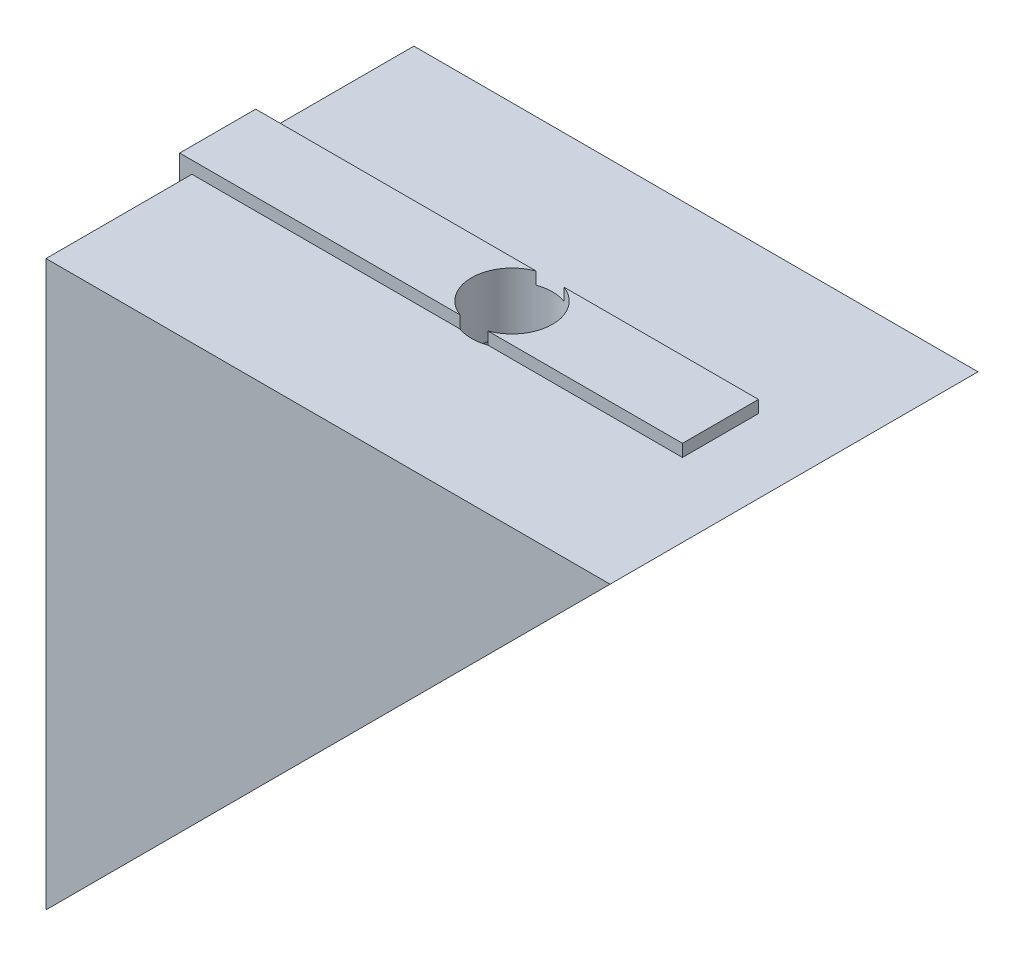
ISO-10303-21;
HEADER;
FILE_DESCRIPTION(('STEP AP214'),'2;1');
FILE_NAME('part.step','',(''),(''),'','','');
FILE_SCHEMA(('AUTOMOTIVE_DESIGN { 1 0 10303 214 1 1 1 1 }'));
ENDSEC;
DATA;
#1=APPLICATION_CONTEXT('core data for automotive mechanical design processes');
#2=APPLICATION_PROTOCOL_DEFINITION('international standard','automotive_design',2000,#1);
#3=PRODUCT_CONTEXT('',#1,'mechanical');
#4=PRODUCT('Part','Part','',(#3));
#5=PRODUCT_RELATED_PRODUCT_CATEGORY('part','',(#4));
#6=PRODUCT_DEFINITION_FORMATION('','',#4);
#7=PRODUCT_DEFINITION_CONTEXT('part definition',#1,'design');
#8=PRODUCT_DEFINITION('design','',#6,#7);
#9=PRODUCT_DEFINITION_SHAPE('','',#8);
#10=(LENGTH_UNIT() NAMED_UNIT(*) SI_UNIT(.MILLI.,.METRE.));
#11=(NAMED_UNIT(*) PLANE_ANGLE_UNIT() SI_UNIT($,.RADIAN.));
#12=(NAMED_UNIT(*) SI_UNIT($,.STERADIAN.) SOLID_ANGLE_UNIT());
#13=UNCERTAINTY_MEASURE_WITH_UNIT(LENGTH_MEASURE(1.E-05),#10,'distance_accuracy_value','');
#14=(GEOMETRIC_REPRESENTATION_CONTEXT(3) GLOBAL_UNCERTAINTY_ASSIGNED_CONTEXT((#13)) GLOBAL_UNIT_ASSIGNED_CONTEXT((#10,
#11,#12)) REPRESENTATION_CONTEXT('',''));
#15=CARTESIAN_POINT('',(0.,0.,0.));
#16=DIRECTION('',(0.,0.,1.));
#17=DIRECTION('',(1.,0.,0.));
#18=AXIS2_PLACEMENT_3D('',#15,#16,#17);
#19=CARTESIAN_POINT('',(-195.002,-19.,7.5));
#20=DIRECTION('',(1.,0.,0.));
#21=DIRECTION('',(0.,0.,-1.));
#22=AXIS2_PLACEMENT_3D('',#19,#20,#21);
#23=CYLINDRICAL_SURFACE('',#22,1.65);
#24=CARTESIAN_POINT('',(-180.,-19.,7.5));
#25=DIRECTION('',(1.,0.,0.));
#26=DIRECTION('',(0.,0.,1.));
#27=AXIS2_PLACEMENT_3D('',#24,#25,#26);
#28=CIRCLE('',#27,1.65);
#29=CARTESIAN_POINT('',(-180.,-18.4343145750507,5.95));
#30=VERTEX_POINT('',#29);
#31=CARTESIAN_POINT('',(-180.,-19.5656854249492,5.95));
#32=VERTEX_POINT('',#31);
#33=EDGE_CURVE('E300',#30,#32,#28,.F.);
#34=ORIENTED_EDGE('',*,*,#33,.T.);
#35=DIRECTION('',(1.,0.,0.));
#36=VECTOR('',#35,1.);
#37=CARTESIAN_POINT('',(-180.5,-19.5656854249492,5.95));
#38=LINE('',#37,#36);
#39=CARTESIAN_POINT('',(-180.5,-19.5656854249492,5.95));
#40=VERTEX_POINT('',#39);
#41=EDGE_CURVE('E396',#40,#32,#38,.T.);
#42=ORIENTED_EDGE('',*,*,#41,.F.);
#43=CARTESIAN_POINT('',(-180.5,-19.,7.5));
#44=DIRECTION('',(1.,0.,0.));
#45=DIRECTION('',(0.,0.,1.));
#46=AXIS2_PLACEMENT_3D('',#43,#44,#45);
#47=CIRCLE('',#46,1.65);
#48=CARTESIAN_POINT('',(-180.5,-19.5656854249492,9.05));
#49=VERTEX_POINT('',#48);
#50=EDGE_CURVE('E430',#40,#49,#47,.F.);
#51=ORIENTED_EDGE('',*,*,#50,.T.);
#52=DIRECTION('',(1.,0.,0.));
#53=VECTOR('',#52,1.);
#54=CARTESIAN_POINT('',(-180.5,-19.5656854249492,9.05));
#55=LINE('',#54,#53);
#56=CARTESIAN_POINT('',(-180.,-19.5656854249492,9.05));
#57=VERTEX_POINT('',#56);
#58=EDGE_CURVE('E416',#49,#57,#55,.T.);
#59=ORIENTED_EDGE('',*,*,#58,.T.);
#60=CARTESIAN_POINT('',(-180.,-18.4343145750507,9.05));
#61=VERTEX_POINT('',#60);
#62=EDGE_CURVE('E311',#57,#61,#28,.F.);
#63=ORIENTED_EDGE('',*,*,#62,.T.);
#64=DIRECTION('',(1.,0.,0.));
#65=VECTOR('',#64,1.);
#66=CARTESIAN_POINT('',(-180.5,-18.4343145750507,9.05));
#67=LINE('',#66,#65);
#68=CARTESIAN_POINT('',(-180.5,-18.4343145750507,9.05));
#69=VERTEX_POINT('',#68);
#70=EDGE_CURVE('E371',#69,#61,#67,.T.);
#71=ORIENTED_EDGE('',*,*,#70,.F.);
#72=CARTESIAN_POINT('',(-180.5,-19.,7.5));
#73=DIRECTION('',(1.,0.,0.));
#74=DIRECTION('',(0.,0.,1.));
#75=AXIS2_PLACEMENT_3D('',#72,#73,#74);
#76=CIRCLE('',#75,1.65);
#77=CARTESIAN_POINT('',(-180.5,-18.4343145750507,5.95));
#78=VERTEX_POINT('',#77);
#79=EDGE_CURVE('E390',#69,#78,#76,.F.);
#80=ORIENTED_EDGE('',*,*,#79,.T.);
#81=DIRECTION('',(1.,0.,0.));
#82=VECTOR('',#81,1.);
#83=CARTESIAN_POINT('',(-180.5,-18.4343145750507,5.95));
#84=LINE('',#83,#82);
#85=EDGE_CURVE('E387',#78,#30,#84,.T.);
#86=ORIENTED_EDGE('',*,*,#85,.T.);
#87=EDGE_LOOP('',(#34,#42,#51,#59,#63,#71,#80,#86));
#88=FACE_BOUND('',#87,.T.);
#89=CARTESIAN_POINT('',(-178.,-19.,7.5));
#90=DIRECTION('',(-1.,0.,0.));
#91=DIRECTION('',(0.,-1.,0.));
#92=AXIS2_PLACEMENT_3D('',#89,#90,#91);
#93=CIRCLE('',#92,1.65);
#94=CARTESIAN_POINT('',(-178.,-20.65,7.5));
#95=VERTEX_POINT('',#94);
#96=EDGE_CURVE('E316',#95,#95,#93,.T.);
#97=ORIENTED_EDGE('',*,*,#96,.F.);
#98=EDGE_LOOP('',(#97));
#99=FACE_BOUND('',#98,.T.);
#100=ADVANCED_FACE('F16',(#88,#99),#23,.F.);
#101=CARTESIAN_POINT('',(-168.5,-7.49799999999992,7.5));
#102=DIRECTION('',(0.,-1.,0.));
#103=DIRECTION('',(0.,0.,1.));
#104=AXIS2_PLACEMENT_3D('',#101,#102,#103);
#105=CYLINDRICAL_SURFACE('',#104,1.65);
#106=CARTESIAN_POINT('',(-168.5,-7.49999999999992,7.5));
#107=DIRECTION('',(0.,1.,0.));
#108=DIRECTION('',(0.,0.,1.));
#109=AXIS2_PLACEMENT_3D('',#106,#107,#108);
#110=CIRCLE('',#109,1.65);
#111=CARTESIAN_POINT('',(-169.065685424949,-7.49999999999992,5.95));
#112=VERTEX_POINT('',#111);
#113=CARTESIAN_POINT('',(-167.93431457505,-7.49999999999992,5.95));
#114=VERTEX_POINT('',#113);
#115=EDGE_CURVE('E212',#112,#114,#110,.F.);
#116=ORIENTED_EDGE('',*,*,#115,.F.);
#117=DIRECTION('',(0.,-1.,0.));
#118=VECTOR('',#117,1.);
#119=CARTESIAN_POINT('',(-169.065685424949,-6.99999999999992,5.95));
#120=LINE('',#119,#118);
#121=CARTESIAN_POINT('',(-169.065685424949,-6.99999999999992,5.95));
#122=VERTEX_POINT('',#121);
#123=EDGE_CURVE('E317',#122,#112,#120,.T.);
#124=ORIENTED_EDGE('',*,*,#123,.F.);
#125=CARTESIAN_POINT('',(-168.5,-6.99999999999992,7.5));
#126=DIRECTION('',(0.,1.,0.));
#127=DIRECTION('',(0.,0.,1.));
#128=AXIS2_PLACEMENT_3D('',#125,#126,#127);
#129=CIRCLE('',#128,1.65);
#130=CARTESIAN_POINT('',(-169.065685424949,-6.99999999999992,9.05));
#131=VERTEX_POINT('',#130);
#132=EDGE_CURVE('E341',#131,#122,#129,.F.);
#133=ORIENTED_EDGE('',*,*,#132,.F.);
#134=DIRECTION('',(0.,-1.,0.));
#135=VECTOR('',#134,1.);
#136=CARTESIAN_POINT('',(-169.065685424949,-6.99999999999992,9.05));
#137=LINE('',#136,#135);
#138=CARTESIAN_POINT('',(-169.065685424949,-7.49999999999992,9.05));
#139=VERTEX_POINT('',#138);
#140=EDGE_CURVE('E325',#131,#139,#137,.T.);
#141=ORIENTED_EDGE('',*,*,#140,.T.);
#142=CARTESIAN_POINT('',(-167.93431457505,-7.49999999999992,9.05));
#143=VERTEX_POINT('',#142);
#144=EDGE_CURVE('E294',#143,#139,#110,.F.);
#145=ORIENTED_EDGE('',*,*,#144,.F.);
#146=DIRECTION('',(0.,-1.,0.));
#147=VECTOR('',#146,1.);
#148=CARTESIAN_POINT('',(-167.93431457505,-6.99999999999992,9.05));
#149=LINE('',#148,#147);
#150=CARTESIAN_POINT('',(-167.93431457505,-6.99999999999992,9.05));
#151=VERTEX_POINT('',#150);
#152=EDGE_CURVE('E358',#151,#143,#149,.T.);
#153=ORIENTED_EDGE('',*,*,#152,.F.);
#154=CARTESIAN_POINT('',(-168.5,-6.99999999999992,7.5));
#155=DIRECTION('',(0.,1.,0.));
#156=DIRECTION('',(0.,0.,1.));
#157=AXIS2_PLACEMENT_3D('',#154,#155,#156);
#158=CIRCLE('',#157,1.65);
#159=CARTESIAN_POINT('',(-167.93431457505,-6.99999999999992,5.95));
#160=VERTEX_POINT('',#159);
#161=EDGE_CURVE('E367',#160,#151,#158,.F.);
#162=ORIENTED_EDGE('',*,*,#161,.F.);
#163=DIRECTION('',(0.,-1.,0.));
#164=VECTOR('',#163,1.);
#165=CARTESIAN_POINT('',(-167.93431457505,-6.99999999999992,5.95));
#166=LINE('',#165,#164);
#167=EDGE_CURVE('E340',#160,#114,#166,.T.);
#168=ORIENTED_EDGE('',*,*,#167,.T.);
#169=EDGE_LOOP('',(#116,#124,#133,#141,#145,#153,#162,#168));
#170=FACE_BOUND('',#169,.T.);
#171=CARTESIAN_POINT('',(-168.5,-9.5,7.5));
#172=DIRECTION('',(0.,1.,0.));
#173=DIRECTION('',(-1.,0.,0.));
#174=AXIS2_PLACEMENT_3D('',#171,#172,#173);
#175=CIRCLE('',#174,1.65);
#176=CARTESIAN_POINT('',(-170.15,-9.5,7.5));
#177=VERTEX_POINT('',#176);
#178=EDGE_CURVE('E299',#177,#177,#175,.T.);
#179=ORIENTED_EDGE('',*,*,#178,.F.);
#180=EDGE_LOOP('',(#179));
#181=FACE_BOUND('',#180,.T.);
#182=ADVANCED_FACE('F464',(#170,#181),#105,.F.);
#183=CARTESIAN_POINT('',(-168.5,-10.5,15.));
#184=DIRECTION('',(0.,-1.,0.));
#185=DIRECTION('',(0.,0.,1.));
#186=AXIS2_PLACEMENT_3D('',#183,#184,#185);
#187=PLANE('',#186);
#188=CARTESIAN_POINT('',(-168.5,-10.5,7.5));
#189=DIRECTION('',(0.,1.,0.));
#190=DIRECTION('',(-1.,0.,0.));
#191=AXIS2_PLACEMENT_3D('',#188,#189,#190);
#192=CIRCLE('',#191,2.8);
#193=CARTESIAN_POINT('',(-171.3,-10.5,7.5));
#194=VERTEX_POINT('',#193);
#195=EDGE_CURVE('E295',#194,#194,#192,.T.);
#196=ORIENTED_EDGE('',*,*,#195,.T.);
#197=EDGE_LOOP('',(#196));
#198=FACE_BOUND('',#197,.T.);
#199=DIRECTION('',(0.,0.,-1.));
#200=VECTOR('',#199,1.);
#201=CARTESIAN_POINT('',(-177.,-10.5,15.));
#202=LINE('',#201,#200);
#203=CARTESIAN_POINT('',(-177.,-10.5,13.));
#204=VERTEX_POINT('',#203);
#205=CARTESIAN_POINT('',(-177.,-10.5,2.));
#206=VERTEX_POINT('',#205);
#207=EDGE_CURVE('E235',#204,#206,#202,.T.);
#208=ORIENTED_EDGE('',*,*,#207,.T.);
#209=DIRECTION('',(1.,0.,0.));
#210=VECTOR('',#209,1.);
#211=CARTESIAN_POINT('',(-168.5,-10.5,2.));
#212=LINE('',#211,#210);
#213=CARTESIAN_POINT('',(-160.,-10.5,2.));
#214=VERTEX_POINT('',#213);
#215=EDGE_CURVE('E263',#206,#214,#212,.T.);
#216=ORIENTED_EDGE('',*,*,#215,.T.);
#217=DIRECTION('',(0.,0.,-1.));
#218=VECTOR('',#217,1.);
#219=CARTESIAN_POINT('',(-160.,-10.5,15.));
#220=LINE('',#219,#218);
#221=CARTESIAN_POINT('',(-160.,-10.5,13.));
#222=VERTEX_POINT('',#221);
#223=EDGE_CURVE('E247',#222,#214,#220,.T.);
#224=ORIENTED_EDGE('',*,*,#223,.F.);
#225=DIRECTION('',(1.,0.,0.));
#226=VECTOR('',#225,1.);
#227=CARTESIAN_POINT('',(-168.5,-10.5,13.));
#228=LINE('',#227,#226);
#229=EDGE_CURVE('E265',#204,#222,#228,.T.);
#230=ORIENTED_EDGE('',*,*,#229,.F.);
#231=EDGE_LOOP('',(#208,#216,#224,#230));
#232=FACE_BOUND('',#231,.T.);
#233=ADVANCED_FACE('F260',(#198,#232),#187,.T.);
#234=CARTESIAN_POINT('',(-177.,-19.,15.));
#235=DIRECTION('',(1.,0.,0.));
#236=DIRECTION('',(0.,0.,-1.));
#237=AXIS2_PLACEMENT_3D('',#234,#235,#236);
#238=PLANE('',#237);
#239=CARTESIAN_POINT('',(-177.,-19.,7.5));
#240=DIRECTION('',(-1.,0.,0.));
#241=DIRECTION('',(0.,-1.,0.));
#242=AXIS2_PLACEMENT_3D('',#239,#240,#241);
#243=CIRCLE('',#242,2.8);
#244=CARTESIAN_POINT('',(-177.,-21.8,7.5));
#245=VERTEX_POINT('',#244);
#246=EDGE_CURVE('E312',#245,#245,#243,.T.);
#247=ORIENTED_EDGE('',*,*,#246,.T.);
#248=EDGE_LOOP('',(#247));
#249=FACE_BOUND('',#248,.T.);
#250=DIRECTION('',(0.,0.,-1.));
#251=VECTOR('',#250,1.);
#252=CARTESIAN_POINT('',(-177.,-27.5,15.));
#253=LINE('',#252,#251);
#254=CARTESIAN_POINT('',(-177.,-27.5,13.));
#255=VERTEX_POINT('',#254);
#256=CARTESIAN_POINT('',(-177.,-27.5,2.));
#257=VERTEX_POINT('',#256);
#258=EDGE_CURVE('E228',#255,#257,#253,.T.);
#259=ORIENTED_EDGE('',*,*,#258,.T.);
#260=DIRECTION('',(0.,1.,0.));
#261=VECTOR('',#260,1.);
#262=CARTESIAN_POINT('',(-177.,-19.,2.));
#263=LINE('',#262,#261);
#264=EDGE_CURVE('E272',#257,#206,#263,.T.);
#265=ORIENTED_EDGE('',*,*,#264,.T.);
#266=ORIENTED_EDGE('',*,*,#207,.F.);
#267=DIRECTION('',(0.,1.,0.));
#268=VECTOR('',#267,1.);
#269=CARTESIAN_POINT('',(-177.,-19.,13.));
#270=LINE('',#269,#268);
#271=EDGE_CURVE('E269',#255,#204,#270,.T.);
#272=ORIENTED_EDGE('',*,*,#271,.F.);
#273=EDGE_LOOP('',(#259,#265,#266,#272));
#274=FACE_BOUND('',#273,.T.);
#275=ADVANCED_FACE('F268',(#249,#274),#238,.T.);
#276=CARTESIAN_POINT('',(-178.5,-27.5,15.));
#277=DIRECTION('',(0.,-1.,0.));
#278=DIRECTION('',(0.,0.,1.));
#279=AXIS2_PLACEMENT_3D('',#276,#277,#278);
#280=PLANE('',#279);
#281=DIRECTION('',(0.,0.,1.));
#282=VECTOR('',#281,1.);
#283=CARTESIAN_POINT('',(-180.,-27.5,-0.00200000000000027));
#284=LINE('',#283,#282);
#285=CARTESIAN_POINT('',(-180.,-27.5,5.95));
#286=VERTEX_POINT('',#285);
#287=CARTESIAN_POINT('',(-180.,-27.5,9.05));
#288=VERTEX_POINT('',#287);
#289=EDGE_CURVE('E440',#286,#288,#284,.T.);
#290=ORIENTED_EDGE('',*,*,#289,.T.);
#291=DIRECTION('',(1.,0.,0.));
#292=VECTOR('',#291,1.);
#293=CARTESIAN_POINT('',(-180.5,-27.5,9.05));
#294=LINE('',#293,#292);
#295=CARTESIAN_POINT('',(-180.5,-27.5,9.05));
#296=VERTEX_POINT('',#295);
#297=EDGE_CURVE('E412',#296,#288,#294,.T.);
#298=ORIENTED_EDGE('',*,*,#297,.F.);
#299=DIRECTION('',(0.,0.,-1.));
#300=VECTOR('',#299,1.);
#301=CARTESIAN_POINT('',(-180.5,-27.5,15.));
#302=LINE('',#301,#300);
#303=CARTESIAN_POINT('',(-180.5,-27.5,5.95));
#304=VERTEX_POINT('',#303);
#305=EDGE_CURVE('E424',#296,#304,#302,.T.);
#306=ORIENTED_EDGE('',*,*,#305,.T.);
#307=DIRECTION('',(1.,0.,0.));
#308=VECTOR('',#307,1.);
#309=CARTESIAN_POINT('',(-180.5,-27.5,5.95));
#310=LINE('',#309,#308);
#311=EDGE_CURVE('E408',#304,#286,#310,.T.);
#312=ORIENTED_EDGE('',*,*,#311,.T.);
#313=EDGE_LOOP('',(#290,#298,#306,#312));
#314=FACE_BOUND('',#313,.T.);
#315=ADVANCED_FACE('F18',(#314),#280,.T.);
#316=CARTESIAN_POINT('',(-180.,-17.5,15.));
#317=DIRECTION('',(1.,0.,0.));
#318=DIRECTION('',(0.,0.,-1.));
#319=AXIS2_PLACEMENT_3D('',#316,#317,#318);
#320=PLANE('',#319);
#321=ORIENTED_EDGE('',*,*,#33,.F.);
#322=DIRECTION('',(0.,-1.,0.));
#323=VECTOR('',#322,1.);
#324=CARTESIAN_POINT('',(-180.,-16.9,5.95));
#325=LINE('',#324,#323);
#326=CARTESIAN_POINT('',(-180.,-7.49999999999992,5.95));
#327=VERTEX_POINT('',#326);
#328=EDGE_CURVE('E392',#327,#30,#325,.T.);
#329=ORIENTED_EDGE('',*,*,#328,.F.);
#330=DIRECTION('',(0.,0.,-1.));
#331=VECTOR('',#330,1.);
#332=CARTESIAN_POINT('',(-180.,-7.49999999999992,15.));
#333=LINE('',#332,#331);
#334=CARTESIAN_POINT('',(-180.,-7.49999999999992,0.));
#335=VERTEX_POINT('',#334);
#336=EDGE_CURVE('E250',#327,#335,#333,.T.);
#337=ORIENTED_EDGE('',*,*,#336,.T.);
#338=DIRECTION('',(0.,1.,0.));
#339=VECTOR('',#338,1.);
#340=CARTESIAN_POINT('',(-180.,-17.5,0.));
#341=LINE('',#340,#339);
#342=CARTESIAN_POINT('',(-180.,-30.5,0.));
#343=VERTEX_POINT('',#342);
#344=EDGE_CURVE('E242',#343,#335,#341,.T.);
#345=ORIENTED_EDGE('',*,*,#344,.F.);
#346=DIRECTION('',(0.,0.,1.));
#347=VECTOR('',#346,1.);
#348=CARTESIAN_POINT('',(-180.,-30.5,-0.00200000000000027));
#349=LINE('',#348,#347);
#350=CARTESIAN_POINT('',(-180.,-30.5,15.));
#351=VERTEX_POINT('',#350);
#352=EDGE_CURVE('E427',#343,#351,#349,.T.);
#353=ORIENTED_EDGE('',*,*,#352,.T.);
#354=DIRECTION('',(0.,1.,0.));
#355=VECTOR('',#354,1.);
#356=CARTESIAN_POINT('',(-180.,-17.5,15.));
#357=LINE('',#356,#355);
#358=CARTESIAN_POINT('',(-180.,-7.49999999999992,15.));
#359=VERTEX_POINT('',#358);
#360=EDGE_CURVE('E206',#351,#359,#357,.T.);
#361=ORIENTED_EDGE('',*,*,#360,.T.);
#362=CARTESIAN_POINT('',(-180.,-7.49999999999992,9.05));
#363=VERTEX_POINT('',#362);
#364=EDGE_CURVE('E20',#359,#363,#333,.T.);
#365=ORIENTED_EDGE('',*,*,#364,.T.);
#366=DIRECTION('',(0.,-1.,0.));
#367=VECTOR('',#366,1.);
#368=CARTESIAN_POINT('',(-180.,-6.99999999999992,9.05));
#369=LINE('',#368,#367);
#370=EDGE_CURVE('E10',#363,#61,#369,.T.);
#371=ORIENTED_EDGE('',*,*,#370,.T.);
#372=ORIENTED_EDGE('',*,*,#62,.F.);
#373=DIRECTION('',(0.,-1.,0.));
#374=VECTOR('',#373,1.);
#375=CARTESIAN_POINT('',(-180.,-17.6,9.05));
#376=LINE('',#375,#374);
#377=EDGE_CURVE('E38',#57,#288,#376,.T.);
#378=ORIENTED_EDGE('',*,*,#377,.T.);
#379=ORIENTED_EDGE('',*,*,#289,.F.);
#380=DIRECTION('',(0.,-1.,0.));
#381=VECTOR('',#380,1.);
#382=CARTESIAN_POINT('',(-180.,-16.9,5.95));
#383=LINE('',#382,#381);
#384=EDGE_CURVE('E49',#32,#286,#383,.T.);
#385=ORIENTED_EDGE('',*,*,#384,.F.);
#386=EDGE_LOOP('',(#321,#329,#337,#345,#353,#361,#365,#371,#372,#378,#379,#385));
#387=FACE_BOUND('',#386,.T.);
#388=ADVANCED_FACE('F506',(#387),#320,.F.);
#389=CARTESIAN_POINT('',(-178.5,-7.49999999999992,15.));
#390=DIRECTION('',(0.,-1.,0.));
#391=DIRECTION('',(0.,0.,1.));
#392=AXIS2_PLACEMENT_3D('',#389,#390,#391);
#393=PLANE('',#392);
#394=DIRECTION('',(1.,0.,0.));
#395=VECTOR('',#394,1.);
#396=CARTESIAN_POINT('',(-170.,-7.49999999999992,5.95));
#397=LINE('',#396,#395);
#398=CARTESIAN_POINT('',(-160.,-7.49999999999992,5.95));
#399=VERTEX_POINT('',#398);
#400=EDGE_CURVE('E368',#114,#399,#397,.T.);
#401=ORIENTED_EDGE('',*,*,#400,.T.);
#402=DIRECTION('',(0.,0.,1.));
#403=VECTOR('',#402,1.);
#404=CARTESIAN_POINT('',(-160.,-7.49999999999992,-0.00200000000000027));
#405=LINE('',#404,#403);
#406=CARTESIAN_POINT('',(-160.,-7.49999999999992,9.05));
#407=VERTEX_POINT('',#406);
#408=EDGE_CURVE('E222',#399,#407,#405,.T.);
#409=ORIENTED_EDGE('',*,*,#408,.T.);
#410=DIRECTION('',(1.,0.,0.));
#411=VECTOR('',#410,1.);
#412=CARTESIAN_POINT('',(-170.,-7.49999999999992,9.05));
#413=LINE('',#412,#411);
#414=EDGE_CURVE('E363',#143,#407,#413,.T.);
#415=ORIENTED_EDGE('',*,*,#414,.F.);
#416=ORIENTED_EDGE('',*,*,#144,.T.);
#417=DIRECTION('',(1.,0.,0.));
#418=VECTOR('',#417,1.);
#419=CARTESIAN_POINT('',(-170.,-7.49999999999992,9.05));
#420=LINE('',#419,#418);
#421=EDGE_CURVE('E337',#363,#139,#420,.T.);
#422=ORIENTED_EDGE('',*,*,#421,.F.);
#423=ORIENTED_EDGE('',*,*,#364,.F.);
#424=DIRECTION('',(1.,0.,0.));
#425=VECTOR('',#424,1.);
#426=CARTESIAN_POINT('',(-178.5,-7.49999999999992,15.));
#427=LINE('',#426,#425);
#428=CARTESIAN_POINT('',(-157.,-7.49999999999987,15.));
#429=VERTEX_POINT('',#428);
#430=EDGE_CURVE('E203',#359,#429,#427,.T.);
#431=ORIENTED_EDGE('',*,*,#430,.T.);
#432=DIRECTION('',(0.,0.,1.));
#433=VECTOR('',#432,1.);
#434=CARTESIAN_POINT('',(-157.,-7.49999999999987,-0.00200000000000027));
#435=LINE('',#434,#433);
#436=CARTESIAN_POINT('',(-157.,-7.49999999999987,0.));
#437=VERTEX_POINT('',#436);
#438=EDGE_CURVE('E215',#437,#429,#435,.T.);
#439=ORIENTED_EDGE('',*,*,#438,.F.);
#440=DIRECTION('',(1.,0.,0.));
#441=VECTOR('',#440,1.);
#442=CARTESIAN_POINT('',(-178.5,-7.49999999999992,0.));
#443=LINE('',#442,#441);
#444=EDGE_CURVE('E238',#335,#437,#443,.T.);
#445=ORIENTED_EDGE('',*,*,#444,.F.);
#446=ORIENTED_EDGE('',*,*,#336,.F.);
#447=DIRECTION('',(1.,0.,0.));
#448=VECTOR('',#447,1.);
#449=CARTESIAN_POINT('',(-170.,-7.49999999999992,5.95));
#450=LINE('',#449,#448);
#451=EDGE_CURVE('E333',#327,#112,#450,.T.);
#452=ORIENTED_EDGE('',*,*,#451,.T.);
#453=ORIENTED_EDGE('',*,*,#115,.T.);
#454=EDGE_LOOP('',(#401,#409,#415,#416,#422,#423,#431,#439,#445,#446,#452,#453));
#455=FACE_BOUND('',#454,.T.);
#456=ADVANCED_FACE('F225',(#455),#393,.F.);
#457=CARTESIAN_POINT('',(-160.,-9.,15.));
#458=DIRECTION('',(-1.,0.,0.));
#459=DIRECTION('',(0.,0.,1.));
#460=AXIS2_PLACEMENT_3D('',#457,#458,#459);
#461=PLANE('',#460);
#462=DIRECTION('',(0.,-1.,0.));
#463=VECTOR('',#462,1.);
#464=CARTESIAN_POINT('',(-160.,-6.99999999999992,5.95));
#465=LINE('',#464,#463);
#466=CARTESIAN_POINT('',(-160.,-6.99999999999992,5.95));
#467=VERTEX_POINT('',#466);
#468=EDGE_CURVE('E352',#467,#399,#465,.T.);
#469=ORIENTED_EDGE('',*,*,#468,.F.);
#470=DIRECTION('',(0.,0.,-1.));
#471=VECTOR('',#470,1.);
#472=CARTESIAN_POINT('',(-160.,-6.99999999999992,15.));
#473=LINE('',#472,#471);
#474=CARTESIAN_POINT('',(-160.,-6.99999999999992,9.05));
#475=VERTEX_POINT('',#474);
#476=EDGE_CURVE('E372',#475,#467,#473,.T.);
#477=ORIENTED_EDGE('',*,*,#476,.F.);
#478=DIRECTION('',(0.,-1.,0.));
#479=VECTOR('',#478,1.);
#480=CARTESIAN_POINT('',(-160.,-6.99999999999992,9.05));
#481=LINE('',#480,#479);
#482=EDGE_CURVE('E355',#475,#407,#481,.T.);
#483=ORIENTED_EDGE('',*,*,#482,.T.);
#484=ORIENTED_EDGE('',*,*,#408,.F.);
#485=EDGE_LOOP('',(#469,#477,#483,#484));
#486=FACE_BOUND('',#485,.T.);
#487=ADVANCED_FACE('F454',(#486),#461,.F.);
#488=CARTESIAN_POINT('',(-170.,-17.5,15.));
#489=DIRECTION('',(0.,0.,1.));
#490=DIRECTION('',(1.,0.,0.));
#491=AXIS2_PLACEMENT_3D('',#488,#489,#490);
#492=PLANE('',#491);
#493=ORIENTED_EDGE('',*,*,#430,.F.);
#494=ORIENTED_EDGE('',*,*,#360,.F.);
#495=DIRECTION('',(0.707106781186548,0.707106781186547,0.));
#496=VECTOR('',#495,1.);
#497=CARTESIAN_POINT('',(-168.5,-19.,15.));
#498=LINE('',#497,#496);
#499=EDGE_CURVE('E199',#351,#429,#498,.T.);
#500=ORIENTED_EDGE('',*,*,#499,.T.);
#501=EDGE_LOOP('',(#493,#494,#500));
#502=FACE_BOUND('',#501,.T.);
#503=ADVANCED_FACE('F201',(#502),#492,.T.);
#504=CARTESIAN_POINT('',(-170.,-17.5,0.));
#505=DIRECTION('',(0.,0.,1.));
#506=DIRECTION('',(1.,0.,0.));
#507=AXIS2_PLACEMENT_3D('',#504,#505,#506);
#508=PLANE('',#507);
#509=DIRECTION('',(0.707106781186548,0.707106781186547,0.));
#510=VECTOR('',#509,1.);
#511=CARTESIAN_POINT('',(-168.5,-19.,0.));
#512=LINE('',#511,#510);
#513=EDGE_CURVE('E218',#343,#437,#512,.T.);
#514=ORIENTED_EDGE('',*,*,#513,.F.);
#515=ORIENTED_EDGE('',*,*,#344,.T.);
#516=ORIENTED_EDGE('',*,*,#444,.T.);
#517=EDGE_LOOP('',(#514,#515,#516));
#518=FACE_BOUND('',#517,.T.);
#519=ADVANCED_FACE('F549',(#518),#508,.F.);
#520=CARTESIAN_POINT('',(-168.5,-19.,2.));
#521=DIRECTION('',(0.707106781186547,-0.707106781186548,0.));
#522=DIRECTION('',(-0.707106781186548,-0.707106781186547,0.));
#523=AXIS2_PLACEMENT_3D('',#520,#521,#522);
#524=PLANE('',#523);
#525=ORIENTED_EDGE('',*,*,#438,.T.);
#526=ORIENTED_EDGE('',*,*,#499,.F.);
#527=ORIENTED_EDGE('',*,*,#352,.F.);
#528=ORIENTED_EDGE('',*,*,#513,.T.);
#529=EDGE_LOOP('',(#525,#526,#527,#528));
#530=FACE_BOUND('',#529,.T.);
#531=DIRECTION('',(0.707106781186548,0.707106781186547,0.));
#532=VECTOR('',#531,1.);
#533=CARTESIAN_POINT('',(-168.5,-19.,2.));
#534=LINE('',#533,#532);
#535=EDGE_CURVE('E245',#257,#214,#534,.T.);
#536=ORIENTED_EDGE('',*,*,#535,.F.);
#537=ORIENTED_EDGE('',*,*,#258,.F.);
#538=DIRECTION('',(0.707106781186548,0.707106781186547,0.));
#539=VECTOR('',#538,1.);
#540=CARTESIAN_POINT('',(-168.5,-19.,13.));
#541=LINE('',#540,#539);
#542=EDGE_CURVE('E211',#255,#222,#541,.T.);
#543=ORIENTED_EDGE('',*,*,#542,.T.);
#544=ORIENTED_EDGE('',*,*,#223,.T.);
#545=EDGE_LOOP('',(#536,#537,#543,#544));
#546=FACE_BOUND('',#545,.T.);
#547=ADVANCED_FACE('F216',(#530,#546),#524,.T.);
#548=CARTESIAN_POINT('',(-170.,-17.5,2.));
#549=DIRECTION('',(0.,0.,1.));
#550=DIRECTION('',(1.,0.,0.));
#551=AXIS2_PLACEMENT_3D('',#548,#549,#550);
#552=PLANE('',#551);
#553=ORIENTED_EDGE('',*,*,#264,.F.);
#554=ORIENTED_EDGE('',*,*,#535,.T.);
#555=ORIENTED_EDGE('',*,*,#215,.F.);
#556=EDGE_LOOP('',(#553,#554,#555));
#557=FACE_BOUND('',#556,.T.);
#558=ADVANCED_FACE('F276',(#557),#552,.T.);
#559=CARTESIAN_POINT('',(-170.,-17.5,13.));
#560=DIRECTION('',(0.,0.,1.));
#561=DIRECTION('',(1.,0.,0.));
#562=AXIS2_PLACEMENT_3D('',#559,#560,#561);
#563=PLANE('',#562);
#564=ORIENTED_EDGE('',*,*,#542,.F.);
#565=ORIENTED_EDGE('',*,*,#271,.T.);
#566=ORIENTED_EDGE('',*,*,#229,.T.);
#567=EDGE_LOOP('',(#564,#565,#566));
#568=FACE_BOUND('',#567,.T.);
#569=ADVANCED_FACE('F576',(#568),#563,.F.);
#570=CARTESIAN_POINT('',(-168.5,-9.5,7.5));
#571=DIRECTION('',(0.,-1.,0.));
#572=DIRECTION('',(0.,0.,1.));
#573=AXIS2_PLACEMENT_3D('',#570,#571,#572);
#574=CYLINDRICAL_SURFACE('',#573,2.8);
#575=CARTESIAN_POINT('',(-168.5,-9.5,7.5));
#576=DIRECTION('',(0.,1.,0.));
#577=DIRECTION('',(-1.,0.,0.));
#578=AXIS2_PLACEMENT_3D('',#575,#576,#577);
#579=CIRCLE('',#578,2.8);
#580=CARTESIAN_POINT('',(-171.3,-9.5,7.5));
#581=VERTEX_POINT('',#580);
#582=EDGE_CURVE('E301',#581,#581,#579,.T.);
#583=ORIENTED_EDGE('',*,*,#582,.T.);
#584=EDGE_LOOP('',(#583));
#585=FACE_BOUND('',#584,.T.);
#586=ORIENTED_EDGE('',*,*,#195,.F.);
#587=EDGE_LOOP('',(#586));
#588=FACE_BOUND('',#587,.T.);
#589=ADVANCED_FACE('F573',(#585,#588),#574,.F.);
#590=CARTESIAN_POINT('',(-168.5,-9.5,7.5));
#591=DIRECTION('',(0.,-1.,0.));
#592=DIRECTION('',(-1.,0.,0.));
#593=AXIS2_PLACEMENT_3D('',#590,#591,#592);
#594=PLANE('',#593);
#595=ORIENTED_EDGE('',*,*,#178,.T.);
#596=EDGE_LOOP('',(#595));
#597=FACE_BOUND('',#596,.T.);
#598=ORIENTED_EDGE('',*,*,#582,.F.);
#599=EDGE_LOOP('',(#598));
#600=FACE_BOUND('',#599,.T.);
#601=ADVANCED_FACE('F570',(#597,#600),#594,.T.);
#602=CARTESIAN_POINT('',(-178.,-19.,7.5));
#603=DIRECTION('',(1.,0.,0.));
#604=DIRECTION('',(0.,0.,-1.));
#605=AXIS2_PLACEMENT_3D('',#602,#603,#604);
#606=CYLINDRICAL_SURFACE('',#605,2.8);
#607=CARTESIAN_POINT('',(-178.,-19.,7.5));
#608=DIRECTION('',(-1.,0.,0.));
#609=DIRECTION('',(0.,-1.,0.));
#610=AXIS2_PLACEMENT_3D('',#607,#608,#609);
#611=CIRCLE('',#610,2.8);
#612=CARTESIAN_POINT('',(-178.,-21.8,7.5));
#613=VERTEX_POINT('',#612);
#614=EDGE_CURVE('E318',#613,#613,#611,.T.);
#615=ORIENTED_EDGE('',*,*,#614,.T.);
#616=EDGE_LOOP('',(#615));
#617=FACE_BOUND('',#616,.T.);
#618=ORIENTED_EDGE('',*,*,#246,.F.);
#619=EDGE_LOOP('',(#618));
#620=FACE_BOUND('',#619,.T.);
#621=ADVANCED_FACE('F568',(#617,#620),#606,.F.);
#622=CARTESIAN_POINT('',(-178.,-19.,7.5));
#623=DIRECTION('',(1.,0.,0.));
#624=DIRECTION('',(0.,-1.,0.));
#625=AXIS2_PLACEMENT_3D('',#622,#623,#624);
#626=PLANE('',#625);
#627=ORIENTED_EDGE('',*,*,#96,.T.);
#628=EDGE_LOOP('',(#627));
#629=FACE_BOUND('',#628,.T.);
#630=ORIENTED_EDGE('',*,*,#614,.F.);
#631=EDGE_LOOP('',(#630));
#632=FACE_BOUND('',#631,.T.);
#633=ADVANCED_FACE('F601',(#629,#632),#626,.T.);
#634=CARTESIAN_POINT('',(-170.,-6.99999999999992,5.95));
#635=DIRECTION('',(0.,0.,1.));
#636=DIRECTION('',(1.,0.,0.));
#637=AXIS2_PLACEMENT_3D('',#634,#635,#636);
#638=PLANE('',#637);
#639=ORIENTED_EDGE('',*,*,#451,.F.);
#640=ORIENTED_EDGE('',*,*,#328,.T.);
#641=ORIENTED_EDGE('',*,*,#85,.F.);
#642=DIRECTION('',(0.,-1.,0.));
#643=VECTOR('',#642,1.);
#644=CARTESIAN_POINT('',(-180.5,-16.9,5.95));
#645=LINE('',#644,#643);
#646=CARTESIAN_POINT('',(-180.5,-6.99999999999992,5.95));
#647=VERTEX_POINT('',#646);
#648=EDGE_CURVE('E395',#647,#78,#645,.T.);
#649=ORIENTED_EDGE('',*,*,#648,.F.);
#650=DIRECTION('',(1.,0.,0.));
#651=VECTOR('',#650,1.);
#652=CARTESIAN_POINT('',(-170.,-6.99999999999992,5.95));
#653=LINE('',#652,#651);
#654=EDGE_CURVE('E329',#647,#122,#653,.T.);
#655=ORIENTED_EDGE('',*,*,#654,.T.);
#656=ORIENTED_EDGE('',*,*,#123,.T.);
#657=EDGE_LOOP('',(#639,#640,#641,#649,#655,#656));
#658=FACE_BOUND('',#657,.T.);
#659=ADVANCED_FACE('F523',(#658),#638,.F.);
#660=CARTESIAN_POINT('',(-170.,-6.99999999999992,9.05));
#661=DIRECTION('',(0.,0.,1.));
#662=DIRECTION('',(1.,0.,0.));
#663=AXIS2_PLACEMENT_3D('',#660,#661,#662);
#664=PLANE('',#663);
#665=ORIENTED_EDGE('',*,*,#421,.T.);
#666=ORIENTED_EDGE('',*,*,#140,.F.);
#667=DIRECTION('',(1.,0.,0.));
#668=VECTOR('',#667,1.);
#669=CARTESIAN_POINT('',(-170.,-6.99999999999992,9.05));
#670=LINE('',#669,#668);
#671=CARTESIAN_POINT('',(-180.5,-6.99999999999992,9.05));
#672=VERTEX_POINT('',#671);
#673=EDGE_CURVE('E336',#672,#131,#670,.T.);
#674=ORIENTED_EDGE('',*,*,#673,.F.);
#675=DIRECTION('',(0.,-1.,0.));
#676=VECTOR('',#675,1.);
#677=CARTESIAN_POINT('',(-180.5,-6.99999999999992,9.05));
#678=LINE('',#677,#676);
#679=EDGE_CURVE('E397',#672,#69,#678,.T.);
#680=ORIENTED_EDGE('',*,*,#679,.T.);
#681=ORIENTED_EDGE('',*,*,#70,.T.);
#682=ORIENTED_EDGE('',*,*,#370,.F.);
#683=EDGE_LOOP('',(#665,#666,#674,#680,#681,#682));
#684=FACE_BOUND('',#683,.T.);
#685=ADVANCED_FACE('F509',(#684),#664,.T.);
#686=CARTESIAN_POINT('',(-170.,-6.99999999999992,7.5));
#687=DIRECTION('',(0.,1.,0.));
#688=DIRECTION('',(1.,0.,0.));
#689=AXIS2_PLACEMENT_3D('',#686,#687,#688);
#690=PLANE('',#689);
#691=ORIENTED_EDGE('',*,*,#673,.T.);
#692=ORIENTED_EDGE('',*,*,#132,.T.);
#693=ORIENTED_EDGE('',*,*,#654,.F.);
#694=DIRECTION('',(0.,0.,-1.));
#695=VECTOR('',#694,1.);
#696=CARTESIAN_POINT('',(-180.5,-6.99999999999992,15.));
#697=LINE('',#696,#695);
#698=EDGE_CURVE('E400',#672,#647,#697,.T.);
#699=ORIENTED_EDGE('',*,*,#698,.F.);
#700=EDGE_LOOP('',(#691,#692,#693,#699));
#701=FACE_BOUND('',#700,.T.);
#702=ADVANCED_FACE('F619',(#701),#690,.T.);
#703=CARTESIAN_POINT('',(-170.,-6.99999999999992,5.95));
#704=DIRECTION('',(0.,0.,1.));
#705=DIRECTION('',(1.,0.,0.));
#706=AXIS2_PLACEMENT_3D('',#703,#704,#705);
#707=PLANE('',#706);
#708=ORIENTED_EDGE('',*,*,#400,.F.);
#709=ORIENTED_EDGE('',*,*,#167,.F.);
#710=DIRECTION('',(1.,0.,0.));
#711=VECTOR('',#710,1.);
#712=CARTESIAN_POINT('',(-170.,-6.99999999999992,5.95));
#713=LINE('',#712,#711);
#714=EDGE_CURVE('E376',#160,#467,#713,.T.);
#715=ORIENTED_EDGE('',*,*,#714,.T.);
#716=ORIENTED_EDGE('',*,*,#468,.T.);
#717=EDGE_LOOP('',(#708,#709,#715,#716));
#718=FACE_BOUND('',#717,.T.);
#719=ADVANCED_FACE('F624',(#718),#707,.F.);
#720=CARTESIAN_POINT('',(-170.,-6.99999999999992,9.05));
#721=DIRECTION('',(0.,0.,1.));
#722=DIRECTION('',(1.,0.,0.));
#723=AXIS2_PLACEMENT_3D('',#720,#721,#722);
#724=PLANE('',#723);
#725=ORIENTED_EDGE('',*,*,#414,.T.);
#726=ORIENTED_EDGE('',*,*,#482,.F.);
#727=DIRECTION('',(1.,0.,0.));
#728=VECTOR('',#727,1.);
#729=CARTESIAN_POINT('',(-170.,-6.99999999999992,9.05));
#730=LINE('',#729,#728);
#731=EDGE_CURVE('E362',#151,#475,#730,.T.);
#732=ORIENTED_EDGE('',*,*,#731,.F.);
#733=ORIENTED_EDGE('',*,*,#152,.T.);
#734=EDGE_LOOP('',(#725,#726,#732,#733));
#735=FACE_BOUND('',#734,.T.);
#736=ADVANCED_FACE('F458',(#735),#724,.T.);
#737=CARTESIAN_POINT('',(-170.,-6.99999999999992,7.5));
#738=DIRECTION('',(0.,1.,0.));
#739=DIRECTION('',(1.,0.,0.));
#740=AXIS2_PLACEMENT_3D('',#737,#738,#739);
#741=PLANE('',#740);
#742=ORIENTED_EDGE('',*,*,#161,.T.);
#743=ORIENTED_EDGE('',*,*,#731,.T.);
#744=ORIENTED_EDGE('',*,*,#476,.T.);
#745=ORIENTED_EDGE('',*,*,#714,.F.);
#746=EDGE_LOOP('',(#742,#743,#744,#745));
#747=FACE_BOUND('',#746,.T.);
#748=ADVANCED_FACE('F639',(#747),#741,.T.);
#749=CARTESIAN_POINT('',(-180.5,-17.25,7.5));
#750=DIRECTION('',(-1.,0.,0.));
#751=DIRECTION('',(0.,1.,0.));
#752=AXIS2_PLACEMENT_3D('',#749,#750,#751);
#753=PLANE('',#752);
#754=ORIENTED_EDGE('',*,*,#648,.T.);
#755=ORIENTED_EDGE('',*,*,#79,.F.);
#756=ORIENTED_EDGE('',*,*,#679,.F.);
#757=ORIENTED_EDGE('',*,*,#698,.T.);
#758=EDGE_LOOP('',(#754,#755,#756,#757));
#759=FACE_BOUND('',#758,.T.);
#760=ADVANCED_FACE('F514',(#759),#753,.T.);
#761=CARTESIAN_POINT('',(-180.5,-16.9,5.95));
#762=DIRECTION('',(0.,0.,-1.));
#763=DIRECTION('',(-1.,0.,0.));
#764=AXIS2_PLACEMENT_3D('',#761,#762,#763);
#765=PLANE('',#764);
#766=ORIENTED_EDGE('',*,*,#384,.T.);
#767=ORIENTED_EDGE('',*,*,#311,.F.);
#768=DIRECTION('',(0.,-1.,0.));
#769=VECTOR('',#768,1.);
#770=CARTESIAN_POINT('',(-180.5,-16.9,5.95));
#771=LINE('',#770,#769);
#772=EDGE_CURVE('E413',#40,#304,#771,.T.);
#773=ORIENTED_EDGE('',*,*,#772,.F.);
#774=ORIENTED_EDGE('',*,*,#41,.T.);
#775=EDGE_LOOP('',(#766,#767,#773,#774));
#776=FACE_BOUND('',#775,.T.);
#777=ADVANCED_FACE('F650',(#776),#765,.T.);
#778=CARTESIAN_POINT('',(-180.5,-17.6,9.05));
#779=DIRECTION('',(0.,0.,-1.));
#780=DIRECTION('',(0.,-1.,0.));
#781=AXIS2_PLACEMENT_3D('',#778,#779,#780);
#782=PLANE('',#781);
#783=ORIENTED_EDGE('',*,*,#377,.F.);
#784=ORIENTED_EDGE('',*,*,#58,.F.);
#785=DIRECTION('',(0.,-1.,0.));
#786=VECTOR('',#785,1.);
#787=CARTESIAN_POINT('',(-180.5,-17.6,9.05));
#788=LINE('',#787,#786);
#789=EDGE_CURVE('E431',#49,#296,#788,.T.);
#790=ORIENTED_EDGE('',*,*,#789,.T.);
#791=ORIENTED_EDGE('',*,*,#297,.T.);
#792=EDGE_LOOP('',(#783,#784,#790,#791));
#793=FACE_BOUND('',#792,.T.);
#794=ADVANCED_FACE('F657',(#793),#782,.F.);
#795=CARTESIAN_POINT('',(-180.5,-17.25,7.5));
#796=DIRECTION('',(-1.,0.,0.));
#797=DIRECTION('',(0.,1.,0.));
#798=AXIS2_PLACEMENT_3D('',#795,#796,#797);
#799=PLANE('',#798);
#800=ORIENTED_EDGE('',*,*,#772,.T.);
#801=ORIENTED_EDGE('',*,*,#305,.F.);
#802=ORIENTED_EDGE('',*,*,#789,.F.);
#803=ORIENTED_EDGE('',*,*,#50,.F.);
#804=EDGE_LOOP('',(#800,#801,#802,#803));
#805=FACE_BOUND('',#804,.T.);
#806=ADVANCED_FACE('F664',(#805),#799,.T.);
#807=CLOSED_SHELL('',(#100,#182,#233,#275,#315,#388,#456,#487,#503,#519,#547,#558,#569,#589,
#601,#621,#633,#659,#685,#702,#719,#736,#748,#760,#777,#794,#806));
#808=MANIFOLD_SOLID_BREP('B1',#807);
#809=ADVANCED_BREP_SHAPE_REPRESENTATION('',(#18,#808),#14);
#810=SHAPE_DEFINITION_REPRESENTATION(#9,#809);
ENDSEC;
END-ISO-10303-21;
